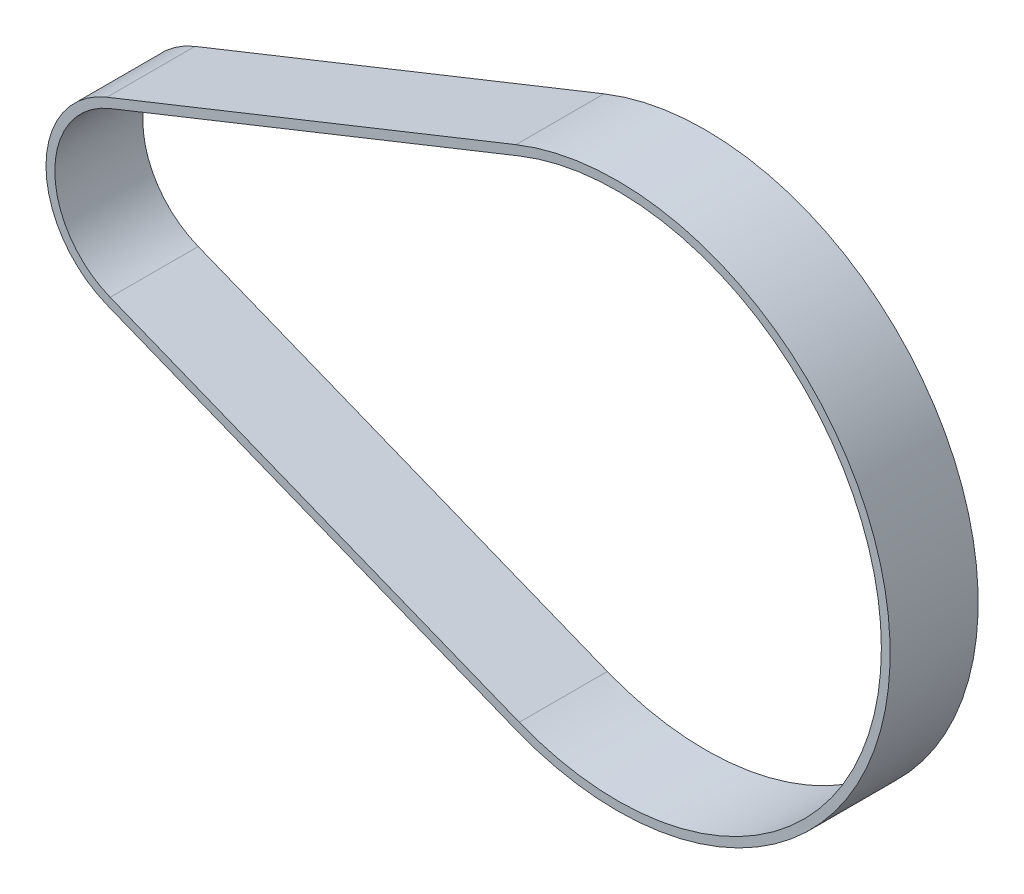
ISO-10303-21;
HEADER;
FILE_DESCRIPTION(('STEP AP214'),'2;1');
FILE_NAME('part.step','',(''),(''),'','','');
FILE_SCHEMA(('AUTOMOTIVE_DESIGN { 1 0 10303 214 1 1 1 1 }'));
ENDSEC;
DATA;
#1=APPLICATION_CONTEXT('core data for automotive mechanical design processes');
#2=APPLICATION_PROTOCOL_DEFINITION('international standard','automotive_design',2000,#1);
#3=PRODUCT_CONTEXT('',#1,'mechanical');
#4=PRODUCT('Part','Part','',(#3));
#5=PRODUCT_RELATED_PRODUCT_CATEGORY('part','',(#4));
#6=PRODUCT_DEFINITION_FORMATION('','',#4);
#7=PRODUCT_DEFINITION_CONTEXT('part definition',#1,'design');
#8=PRODUCT_DEFINITION('design','',#6,#7);
#9=PRODUCT_DEFINITION_SHAPE('','',#8);
#10=(LENGTH_UNIT() NAMED_UNIT(*) SI_UNIT(.MILLI.,.METRE.));
#11=(NAMED_UNIT(*) PLANE_ANGLE_UNIT() SI_UNIT($,.RADIAN.));
#12=(NAMED_UNIT(*) SI_UNIT($,.STERADIAN.) SOLID_ANGLE_UNIT());
#13=UNCERTAINTY_MEASURE_WITH_UNIT(LENGTH_MEASURE(1.E-05),#10,'distance_accuracy_value','');
#14=(GEOMETRIC_REPRESENTATION_CONTEXT(3) GLOBAL_UNCERTAINTY_ASSIGNED_CONTEXT((#13)) GLOBAL_UNIT_ASSIGNED_CONTEXT((#10,
#11,#12)) REPRESENTATION_CONTEXT('',''));
#15=CARTESIAN_POINT('',(0.,0.,0.));
#16=DIRECTION('',(0.,0.,1.));
#17=DIRECTION('',(1.,0.,0.));
#18=AXIS2_PLACEMENT_3D('',#15,#16,#17);
#19=CARTESIAN_POINT('',(0.,0.,10.));
#20=DIRECTION('',(0.,0.,1.));
#21=DIRECTION('',(1.,0.,0.));
#22=AXIS2_PLACEMENT_3D('',#19,#20,#21);
#23=PLANE('',#22);
#24=CARTESIAN_POINT('',(0.,0.,10.));
#25=DIRECTION('',(0.,0.,1.));
#26=DIRECTION('',(1.,0.,0.));
#27=AXIS2_PLACEMENT_3D('',#24,#25,#26);
#28=CIRCLE('',#27,31.);
#29=CARTESIAN_POINT('',(-11.5027829313544,-28.7869064825337,10.));
#30=VERTEX_POINT('',#29);
#31=CARTESIAN_POINT('',(-11.5027829313544,28.7869064825337,10.));
#32=VERTEX_POINT('',#31);
#33=EDGE_CURVE('E142',#30,#32,#28,.T.);
#34=ORIENTED_EDGE('',*,*,#33,.T.);
#35=DIRECTION('',(-0.928609886533346,-0.371057513914657,0.));
#36=VECTOR('',#35,1.);
#37=CARTESIAN_POINT('',(-57.9816326530612,10.2147087518668,10.));
#38=LINE('',#37,#36);
#39=CARTESIAN_POINT('',(-57.9816326530612,10.2147087518668,10.));
#40=VERTEX_POINT('',#39);
#41=EDGE_CURVE('E145',#32,#40,#38,.T.);
#42=ORIENTED_EDGE('',*,*,#41,.T.);
#43=CARTESIAN_POINT('',(-53.9,0.,10.));
#44=DIRECTION('',(0.,0.,1.));
#45=DIRECTION('',(1.,0.,0.));
#46=AXIS2_PLACEMENT_3D('',#43,#44,#45);
#47=CIRCLE('',#46,11.);
#48=CARTESIAN_POINT('',(-57.9816326530612,-10.2147087518668,10.));
#49=VERTEX_POINT('',#48);
#50=EDGE_CURVE('E147',#40,#49,#47,.T.);
#51=ORIENTED_EDGE('',*,*,#50,.T.);
#52=DIRECTION('',(0.928609886533346,-0.371057513914657,0.));
#53=VECTOR('',#52,1.);
#54=CARTESIAN_POINT('',(-11.5027829313544,-28.7869064825337,10.));
#55=LINE('',#54,#53);
#56=EDGE_CURVE('E149',#49,#30,#55,.T.);
#57=ORIENTED_EDGE('',*,*,#56,.T.);
#58=EDGE_LOOP('',(#34,#42,#51,#57));
#59=FACE_BOUND('',#58,.T.);
#60=DIRECTION('',(0.928609886533346,-0.371057513914657,0.));
#61=VECTOR('',#60,1.);
#62=CARTESIAN_POINT('',(-11.1317254174397,-27.8582965960004,10.));
#63=LINE('',#62,#61);
#64=CARTESIAN_POINT('',(-57.6105751391466,-9.28609886533346,10.));
#65=VERTEX_POINT('',#64);
#66=CARTESIAN_POINT('',(-11.1317254174397,-27.8582965960004,10.));
#67=VERTEX_POINT('',#66);
#68=EDGE_CURVE('E124',#65,#67,#63,.T.);
#69=ORIENTED_EDGE('',*,*,#68,.F.);
#70=CARTESIAN_POINT('',(-53.9,0.,10.));
#71=DIRECTION('',(0.,0.,1.));
#72=DIRECTION('',(1.,0.,0.));
#73=AXIS2_PLACEMENT_3D('',#70,#71,#72);
#74=CIRCLE('',#73,9.99999999999999);
#75=CARTESIAN_POINT('',(-57.6105751391466,9.28609886533346,10.));
#76=VERTEX_POINT('',#75);
#77=EDGE_CURVE('E113',#76,#65,#74,.T.);
#78=ORIENTED_EDGE('',*,*,#77,.F.);
#79=DIRECTION('',(-0.928609886533346,-0.371057513914657,0.));
#80=VECTOR('',#79,1.);
#81=CARTESIAN_POINT('',(-57.6105751391466,9.28609886533346,10.));
#82=LINE('',#81,#80);
#83=CARTESIAN_POINT('',(-11.1317254174397,27.8582965960004,10.));
#84=VERTEX_POINT('',#83);
#85=EDGE_CURVE('E128',#84,#76,#82,.T.);
#86=ORIENTED_EDGE('',*,*,#85,.F.);
#87=CARTESIAN_POINT('',(0.,0.,10.));
#88=DIRECTION('',(0.,0.,1.));
#89=DIRECTION('',(1.,0.,0.));
#90=AXIS2_PLACEMENT_3D('',#87,#88,#89);
#91=CIRCLE('',#90,30.);
#92=EDGE_CURVE('E126',#67,#84,#91,.T.);
#93=ORIENTED_EDGE('',*,*,#92,.F.);
#94=EDGE_LOOP('',(#69,#78,#86,#93));
#95=FACE_BOUND('',#94,.T.);
#96=ADVANCED_FACE('F33',(#59,#95),#23,.T.);
#97=CARTESIAN_POINT('',(0.,0.,0.));
#98=DIRECTION('',(0.,0.,1.));
#99=DIRECTION('',(1.,0.,0.));
#100=AXIS2_PLACEMENT_3D('',#97,#98,#99);
#101=PLANE('',#100);
#102=CARTESIAN_POINT('',(0.,0.,0.));
#103=DIRECTION('',(0.,0.,1.));
#104=DIRECTION('',(1.,0.,0.));
#105=AXIS2_PLACEMENT_3D('',#102,#103,#104);
#106=CIRCLE('',#105,31.);
#107=CARTESIAN_POINT('',(-11.5027829313544,-28.7869064825337,0.));
#108=VERTEX_POINT('',#107);
#109=CARTESIAN_POINT('',(-11.5027829313544,28.7869064825337,0.));
#110=VERTEX_POINT('',#109);
#111=EDGE_CURVE('E114',#108,#110,#106,.T.);
#112=ORIENTED_EDGE('',*,*,#111,.F.);
#113=DIRECTION('',(0.928609886533346,-0.371057513914657,0.));
#114=VECTOR('',#113,1.);
#115=CARTESIAN_POINT('',(-11.5027829313544,-28.7869064825337,0.));
#116=LINE('',#115,#114);
#117=CARTESIAN_POINT('',(-57.9816326530612,-10.2147087518668,0.));
#118=VERTEX_POINT('',#117);
#119=EDGE_CURVE('E140',#118,#108,#116,.T.);
#120=ORIENTED_EDGE('',*,*,#119,.F.);
#121=CARTESIAN_POINT('',(-53.9,0.,0.));
#122=DIRECTION('',(0.,0.,1.));
#123=DIRECTION('',(1.,0.,0.));
#124=AXIS2_PLACEMENT_3D('',#121,#122,#123);
#125=CIRCLE('',#124,11.);
#126=CARTESIAN_POINT('',(-57.9816326530612,10.2147087518668,0.));
#127=VERTEX_POINT('',#126);
#128=EDGE_CURVE('E138',#127,#118,#125,.T.);
#129=ORIENTED_EDGE('',*,*,#128,.F.);
#130=DIRECTION('',(-0.928609886533346,-0.371057513914657,0.));
#131=VECTOR('',#130,1.);
#132=CARTESIAN_POINT('',(-57.9816326530612,10.2147087518668,0.));
#133=LINE('',#132,#131);
#134=EDGE_CURVE('E136',#110,#127,#133,.T.);
#135=ORIENTED_EDGE('',*,*,#134,.F.);
#136=EDGE_LOOP('',(#112,#120,#129,#135));
#137=FACE_BOUND('',#136,.T.);
#138=CARTESIAN_POINT('',(-53.9,0.,0.));
#139=DIRECTION('',(0.,0.,1.));
#140=DIRECTION('',(1.,0.,0.));
#141=AXIS2_PLACEMENT_3D('',#138,#139,#140);
#142=CIRCLE('',#141,9.99999999999999);
#143=CARTESIAN_POINT('',(-57.6105751391466,9.28609886533346,0.));
#144=VERTEX_POINT('',#143);
#145=CARTESIAN_POINT('',(-57.6105751391466,-9.28609886533346,0.));
#146=VERTEX_POINT('',#145);
#147=EDGE_CURVE('E56',#144,#146,#142,.T.);
#148=ORIENTED_EDGE('',*,*,#147,.T.);
#149=DIRECTION('',(0.928609886533346,-0.371057513914657,0.));
#150=VECTOR('',#149,1.);
#151=CARTESIAN_POINT('',(-11.1317254174397,-27.8582965960004,0.));
#152=LINE('',#151,#150);
#153=CARTESIAN_POINT('',(-11.1317254174397,-27.8582965960004,0.));
#154=VERTEX_POINT('',#153);
#155=EDGE_CURVE('E100',#146,#154,#152,.T.);
#156=ORIENTED_EDGE('',*,*,#155,.T.);
#157=CARTESIAN_POINT('',(0.,0.,0.));
#158=DIRECTION('',(0.,0.,1.));
#159=DIRECTION('',(1.,0.,0.));
#160=AXIS2_PLACEMENT_3D('',#157,#158,#159);
#161=CIRCLE('',#160,30.);
#162=CARTESIAN_POINT('',(-11.1317254174397,27.8582965960004,0.));
#163=VERTEX_POINT('',#162);
#164=EDGE_CURVE('E109',#154,#163,#161,.T.);
#165=ORIENTED_EDGE('',*,*,#164,.T.);
#166=DIRECTION('',(-0.928609886533346,-0.371057513914657,0.));
#167=VECTOR('',#166,1.);
#168=CARTESIAN_POINT('',(-57.6105751391466,9.28609886533346,0.));
#169=LINE('',#168,#167);
#170=EDGE_CURVE('E118',#163,#144,#169,.T.);
#171=ORIENTED_EDGE('',*,*,#170,.T.);
#172=EDGE_LOOP('',(#148,#156,#165,#171));
#173=FACE_BOUND('',#172,.T.);
#174=ADVANCED_FACE('F117',(#137,#173),#101,.F.);
#175=CARTESIAN_POINT('',(0.,0.,10.));
#176=DIRECTION('',(0.,0.,-1.));
#177=DIRECTION('',(-1.,0.,0.));
#178=AXIS2_PLACEMENT_3D('',#175,#176,#177);
#179=CYLINDRICAL_SURFACE('',#178,31.);
#180=ORIENTED_EDGE('',*,*,#111,.T.);
#181=DIRECTION('',(0.,0.,-1.));
#182=VECTOR('',#181,1.);
#183=CARTESIAN_POINT('',(-11.5027829313544,28.7869064825337,10.));
#184=LINE('',#183,#182);
#185=EDGE_CURVE('E11',#32,#110,#184,.T.);
#186=ORIENTED_EDGE('',*,*,#185,.F.);
#187=ORIENTED_EDGE('',*,*,#33,.F.);
#188=DIRECTION('',(0.,0.,-1.));
#189=VECTOR('',#188,1.);
#190=CARTESIAN_POINT('',(-11.5027829313544,-28.7869064825337,10.));
#191=LINE('',#190,#189);
#192=EDGE_CURVE('E151',#30,#108,#191,.T.);
#193=ORIENTED_EDGE('',*,*,#192,.T.);
#194=EDGE_LOOP('',(#180,#186,#187,#193));
#195=FACE_BOUND('',#194,.T.);
#196=ADVANCED_FACE('F35',(#195),#179,.T.);
#197=CARTESIAN_POINT('',(-57.9816326530612,10.2147087518668,10.));
#198=DIRECTION('',(0.371057513914657,-0.928609886533346,0.));
#199=DIRECTION('',(0.928609886533346,0.371057513914657,0.));
#200=AXIS2_PLACEMENT_3D('',#197,#198,#199);
#201=PLANE('',#200);
#202=ORIENTED_EDGE('',*,*,#134,.T.);
#203=DIRECTION('',(0.,0.,-1.));
#204=VECTOR('',#203,1.);
#205=CARTESIAN_POINT('',(-57.9816326530612,10.2147087518668,10.));
#206=LINE('',#205,#204);
#207=EDGE_CURVE('E41',#40,#127,#206,.T.);
#208=ORIENTED_EDGE('',*,*,#207,.F.);
#209=ORIENTED_EDGE('',*,*,#41,.F.);
#210=ORIENTED_EDGE('',*,*,#185,.T.);
#211=EDGE_LOOP('',(#202,#208,#209,#210));
#212=FACE_BOUND('',#211,.T.);
#213=ADVANCED_FACE('F176',(#212),#201,.F.);
#214=CARTESIAN_POINT('',(-53.9,0.,10.));
#215=DIRECTION('',(0.,0.,-1.));
#216=DIRECTION('',(-1.,0.,0.));
#217=AXIS2_PLACEMENT_3D('',#214,#215,#216);
#218=CYLINDRICAL_SURFACE('',#217,11.);
#219=ORIENTED_EDGE('',*,*,#128,.T.);
#220=DIRECTION('',(0.,0.,-1.));
#221=VECTOR('',#220,1.);
#222=CARTESIAN_POINT('',(-57.9816326530612,-10.2147087518668,10.));
#223=LINE('',#222,#221);
#224=EDGE_CURVE('E154',#49,#118,#223,.T.);
#225=ORIENTED_EDGE('',*,*,#224,.F.);
#226=ORIENTED_EDGE('',*,*,#50,.F.);
#227=ORIENTED_EDGE('',*,*,#207,.T.);
#228=EDGE_LOOP('',(#219,#225,#226,#227));
#229=FACE_BOUND('',#228,.T.);
#230=ADVANCED_FACE('F161',(#229),#218,.T.);
#231=CARTESIAN_POINT('',(-11.5027829313544,-28.7869064825337,10.));
#232=DIRECTION('',(0.371057513914657,0.928609886533346,0.));
#233=DIRECTION('',(-0.928609886533346,0.371057513914657,0.));
#234=AXIS2_PLACEMENT_3D('',#231,#232,#233);
#235=PLANE('',#234);
#236=ORIENTED_EDGE('',*,*,#119,.T.);
#237=ORIENTED_EDGE('',*,*,#192,.F.);
#238=ORIENTED_EDGE('',*,*,#56,.F.);
#239=ORIENTED_EDGE('',*,*,#224,.T.);
#240=EDGE_LOOP('',(#236,#237,#238,#239));
#241=FACE_BOUND('',#240,.T.);
#242=ADVANCED_FACE('F169',(#241),#235,.F.);
#243=CARTESIAN_POINT('',(-53.9,0.,10.));
#244=DIRECTION('',(0.,0.,-1.));
#245=DIRECTION('',(-1.,0.,0.));
#246=AXIS2_PLACEMENT_3D('',#243,#244,#245);
#247=CYLINDRICAL_SURFACE('',#246,9.99999999999999);
#248=ORIENTED_EDGE('',*,*,#147,.F.);
#249=DIRECTION('',(0.,0.,-1.));
#250=VECTOR('',#249,1.);
#251=CARTESIAN_POINT('',(-57.6105751391466,9.28609886533346,10.));
#252=LINE('',#251,#250);
#253=EDGE_CURVE('E130',#76,#144,#252,.T.);
#254=ORIENTED_EDGE('',*,*,#253,.F.);
#255=ORIENTED_EDGE('',*,*,#77,.T.);
#256=DIRECTION('',(0.,0.,-1.));
#257=VECTOR('',#256,1.);
#258=CARTESIAN_POINT('',(-57.6105751391466,-9.28609886533346,10.));
#259=LINE('',#258,#257);
#260=EDGE_CURVE('E102',#65,#146,#259,.T.);
#261=ORIENTED_EDGE('',*,*,#260,.T.);
#262=EDGE_LOOP('',(#248,#254,#255,#261));
#263=FACE_BOUND('',#262,.T.);
#264=ADVANCED_FACE('F111',(#263),#247,.F.);
#265=CARTESIAN_POINT('',(-11.1317254174397,-27.8582965960004,10.));
#266=DIRECTION('',(0.371057513914657,0.928609886533346,0.));
#267=DIRECTION('',(-0.928609886533346,0.371057513914657,0.));
#268=AXIS2_PLACEMENT_3D('',#265,#266,#267);
#269=PLANE('',#268);
#270=ORIENTED_EDGE('',*,*,#155,.F.);
#271=ORIENTED_EDGE('',*,*,#260,.F.);
#272=ORIENTED_EDGE('',*,*,#68,.T.);
#273=DIRECTION('',(0.,0.,-1.));
#274=VECTOR('',#273,1.);
#275=CARTESIAN_POINT('',(-11.1317254174397,-27.8582965960004,10.));
#276=LINE('',#275,#274);
#277=EDGE_CURVE('E105',#67,#154,#276,.T.);
#278=ORIENTED_EDGE('',*,*,#277,.T.);
#279=EDGE_LOOP('',(#270,#271,#272,#278));
#280=FACE_BOUND('',#279,.T.);
#281=ADVANCED_FACE('F101',(#280),#269,.T.);
#282=CARTESIAN_POINT('',(0.,0.,10.));
#283=DIRECTION('',(0.,0.,-1.));
#284=DIRECTION('',(-1.,0.,0.));
#285=AXIS2_PLACEMENT_3D('',#282,#283,#284);
#286=CYLINDRICAL_SURFACE('',#285,30.);
#287=ORIENTED_EDGE('',*,*,#164,.F.);
#288=ORIENTED_EDGE('',*,*,#277,.F.);
#289=ORIENTED_EDGE('',*,*,#92,.T.);
#290=DIRECTION('',(0.,0.,-1.));
#291=VECTOR('',#290,1.);
#292=CARTESIAN_POINT('',(-11.1317254174397,27.8582965960004,10.));
#293=LINE('',#292,#291);
#294=EDGE_CURVE('E48',#84,#163,#293,.T.);
#295=ORIENTED_EDGE('',*,*,#294,.T.);
#296=EDGE_LOOP('',(#287,#288,#289,#295));
#297=FACE_BOUND('',#296,.T.);
#298=ADVANCED_FACE('F198',(#297),#286,.F.);
#299=CARTESIAN_POINT('',(-57.6105751391466,9.28609886533346,10.));
#300=DIRECTION('',(0.371057513914657,-0.928609886533346,0.));
#301=DIRECTION('',(0.928609886533346,0.371057513914657,0.));
#302=AXIS2_PLACEMENT_3D('',#299,#300,#301);
#303=PLANE('',#302);
#304=ORIENTED_EDGE('',*,*,#170,.F.);
#305=ORIENTED_EDGE('',*,*,#294,.F.);
#306=ORIENTED_EDGE('',*,*,#85,.T.);
#307=ORIENTED_EDGE('',*,*,#253,.T.);
#308=EDGE_LOOP('',(#304,#305,#306,#307));
#309=FACE_BOUND('',#308,.T.);
#310=ADVANCED_FACE('F203',(#309),#303,.T.);
#311=CLOSED_SHELL('',(#96,#174,#196,#213,#230,#242,#264,#281,#298,#310));
#312=MANIFOLD_SOLID_BREP('B2',#311);
#313=ADVANCED_BREP_SHAPE_REPRESENTATION('',(#18,#312),#14);
#314=SHAPE_DEFINITION_REPRESENTATION(#9,#313);
ENDSEC;
END-ISO-10303-21;
